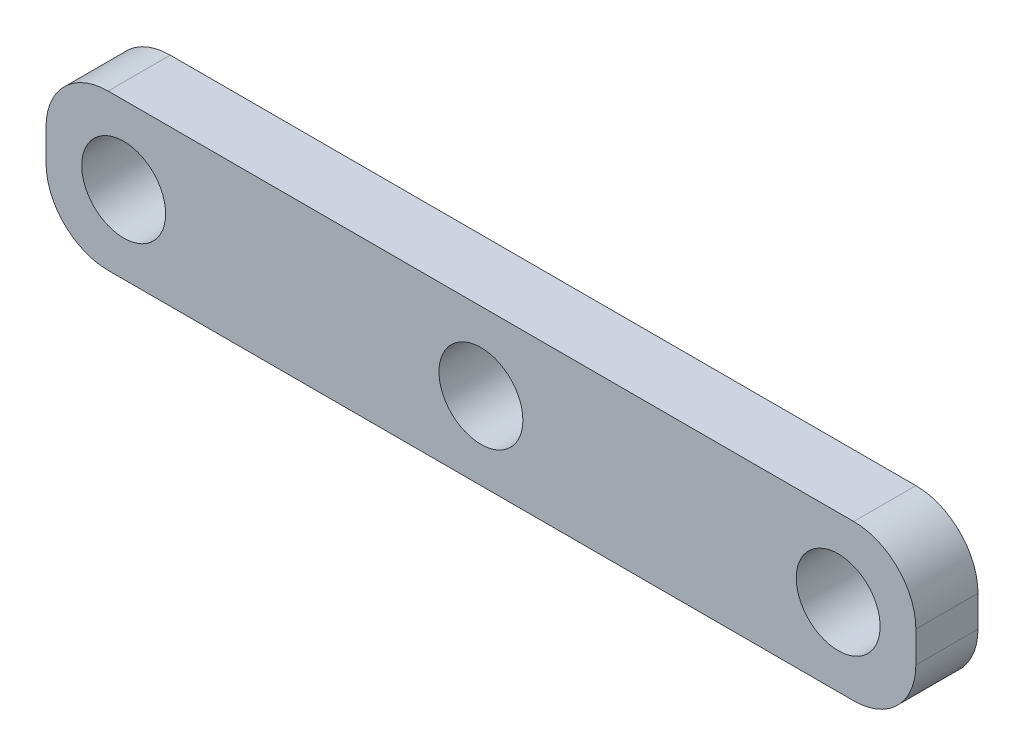
ISO-10303-21;
HEADER;
FILE_DESCRIPTION(('STEP AP214'),'2;1');
FILE_NAME('part.step','',(''),(''),'','','');
FILE_SCHEMA(('AUTOMOTIVE_DESIGN { 1 0 10303 214 1 1 1 1 }'));
ENDSEC;
DATA;
#1=APPLICATION_CONTEXT('core data for automotive mechanical design processes');
#2=APPLICATION_PROTOCOL_DEFINITION('international standard','automotive_design',2000,#1);
#3=PRODUCT_CONTEXT('',#1,'mechanical');
#4=PRODUCT('Part','Part','',(#3));
#5=PRODUCT_RELATED_PRODUCT_CATEGORY('part','',(#4));
#6=PRODUCT_DEFINITION_FORMATION('','',#4);
#7=PRODUCT_DEFINITION_CONTEXT('part definition',#1,'design');
#8=PRODUCT_DEFINITION('design','',#6,#7);
#9=PRODUCT_DEFINITION_SHAPE('','',#8);
#10=(LENGTH_UNIT() NAMED_UNIT(*) SI_UNIT(.MILLI.,.METRE.));
#11=(NAMED_UNIT(*) PLANE_ANGLE_UNIT() SI_UNIT($,.RADIAN.));
#12=(NAMED_UNIT(*) SI_UNIT($,.STERADIAN.) SOLID_ANGLE_UNIT());
#13=UNCERTAINTY_MEASURE_WITH_UNIT(LENGTH_MEASURE(1.E-05),#10,'distance_accuracy_value','');
#14=(GEOMETRIC_REPRESENTATION_CONTEXT(3) GLOBAL_UNCERTAINTY_ASSIGNED_CONTEXT((#13)) GLOBAL_UNIT_ASSIGNED_CONTEXT((#10,
#11,#12)) REPRESENTATION_CONTEXT('',''));
#15=CARTESIAN_POINT('',(0.,0.,0.));
#16=DIRECTION('',(0.,0.,1.));
#17=DIRECTION('',(1.,0.,0.));
#18=AXIS2_PLACEMENT_3D('',#15,#16,#17);
#19=CARTESIAN_POINT('',(0.,0.,2.));
#20=DIRECTION('',(0.,0.,-1.));
#21=DIRECTION('',(-1.,0.,0.));
#22=AXIS2_PLACEMENT_3D('',#19,#20,#21);
#23=PLANE('',#22);
#24=DIRECTION('',(1.,0.,0.));
#25=VECTOR('',#24,1.);
#26=CARTESIAN_POINT('',(-14.,-2.5,2.));
#27=LINE('',#26,#25);
#28=CARTESIAN_POINT('',(-12.,-2.5,2.));
#29=VERTEX_POINT('',#28);
#30=CARTESIAN_POINT('',(12.,-2.5,2.));
#31=VERTEX_POINT('',#30);
#32=EDGE_CURVE('E138',#29,#31,#27,.T.);
#33=ORIENTED_EDGE('',*,*,#32,.T.);
#34=CARTESIAN_POINT('',(12.,-0.500000000000002,2.));
#35=DIRECTION('',(0.,0.,-1.));
#36=DIRECTION('',(-1.,0.,0.));
#37=AXIS2_PLACEMENT_3D('',#34,#35,#36);
#38=CIRCLE('',#37,2.);
#39=CARTESIAN_POINT('',(14.,-0.500000000000003,2.));
#40=VERTEX_POINT('',#39);
#41=EDGE_CURVE('E157',#31,#40,#38,.F.);
#42=ORIENTED_EDGE('',*,*,#41,.T.);
#43=DIRECTION('',(0.,1.,0.));
#44=VECTOR('',#43,1.);
#45=CARTESIAN_POINT('',(14.,-2.5,2.));
#46=LINE('',#45,#44);
#47=CARTESIAN_POINT('',(14.,0.499999999999997,2.));
#48=VERTEX_POINT('',#47);
#49=EDGE_CURVE('E121',#40,#48,#46,.T.);
#50=ORIENTED_EDGE('',*,*,#49,.T.);
#51=CARTESIAN_POINT('',(12.,0.499999999999998,2.));
#52=DIRECTION('',(0.,0.,-1.));
#53=DIRECTION('',(-1.,0.,0.));
#54=AXIS2_PLACEMENT_3D('',#51,#52,#53);
#55=CIRCLE('',#54,2.);
#56=CARTESIAN_POINT('',(12.,2.5,2.));
#57=VERTEX_POINT('',#56);
#58=EDGE_CURVE('E152',#48,#57,#55,.F.);
#59=ORIENTED_EDGE('',*,*,#58,.T.);
#60=DIRECTION('',(-1.,0.,0.));
#61=VECTOR('',#60,1.);
#62=CARTESIAN_POINT('',(-14.,2.5,2.));
#63=LINE('',#62,#61);
#64=CARTESIAN_POINT('',(-12.,2.5,2.));
#65=VERTEX_POINT('',#64);
#66=EDGE_CURVE('E168',#57,#65,#63,.T.);
#67=ORIENTED_EDGE('',*,*,#66,.T.);
#68=CARTESIAN_POINT('',(-12.,0.500000000000001,2.));
#69=DIRECTION('',(0.,0.,-1.));
#70=DIRECTION('',(-1.,0.,0.));
#71=AXIS2_PLACEMENT_3D('',#68,#69,#70);
#72=CIRCLE('',#71,2.);
#73=CARTESIAN_POINT('',(-14.,0.500000000000001,2.));
#74=VERTEX_POINT('',#73);
#75=EDGE_CURVE('E57',#65,#74,#72,.F.);
#76=ORIENTED_EDGE('',*,*,#75,.T.);
#77=DIRECTION('',(0.,-1.,0.));
#78=VECTOR('',#77,1.);
#79=CARTESIAN_POINT('',(-14.,-2.5,2.));
#80=LINE('',#79,#78);
#81=CARTESIAN_POINT('',(-14.,-0.499999999999999,2.));
#82=VERTEX_POINT('',#81);
#83=EDGE_CURVE('E176',#74,#82,#80,.T.);
#84=ORIENTED_EDGE('',*,*,#83,.T.);
#85=CARTESIAN_POINT('',(-12.,-0.499999999999999,2.));
#86=DIRECTION('',(0.,0.,-1.));
#87=DIRECTION('',(-1.,0.,0.));
#88=AXIS2_PLACEMENT_3D('',#85,#86,#87);
#89=CIRCLE('',#88,2.);
#90=EDGE_CURVE('E155',#82,#29,#89,.F.);
#91=ORIENTED_EDGE('',*,*,#90,.T.);
#92=EDGE_LOOP('',(#33,#42,#50,#59,#67,#76,#84,#91));
#93=FACE_BOUND('',#92,.T.);
#94=CARTESIAN_POINT('',(-11.5,0.,2.));
#95=DIRECTION('',(0.,0.,1.));
#96=DIRECTION('',(1.,0.,0.));
#97=AXIS2_PLACEMENT_3D('',#94,#95,#96);
#98=CIRCLE('',#97,1.35);
#99=CARTESIAN_POINT('',(-10.15,0.,2.));
#100=VERTEX_POINT('',#99);
#101=EDGE_CURVE('E129',#100,#100,#98,.T.);
#102=ORIENTED_EDGE('',*,*,#101,.F.);
#103=EDGE_LOOP('',(#102));
#104=FACE_BOUND('',#103,.T.);
#105=CARTESIAN_POINT('',(11.5,0.,2.));
#106=DIRECTION('',(0.,0.,1.));
#107=DIRECTION('',(-1.,0.,0.));
#108=AXIS2_PLACEMENT_3D('',#105,#106,#107);
#109=CIRCLE('',#108,1.35);
#110=CARTESIAN_POINT('',(10.15,0.,2.));
#111=VERTEX_POINT('',#110);
#112=EDGE_CURVE('E183',#111,#111,#109,.T.);
#113=ORIENTED_EDGE('',*,*,#112,.F.);
#114=EDGE_LOOP('',(#113));
#115=FACE_BOUND('',#114,.T.);
#116=CARTESIAN_POINT('',(0.,0.,2.));
#117=DIRECTION('',(0.,0.,1.));
#118=DIRECTION('',(1.,0.,0.));
#119=AXIS2_PLACEMENT_3D('',#116,#117,#118);
#120=CIRCLE('',#119,1.35);
#121=CARTESIAN_POINT('',(1.35,0.,2.));
#122=VERTEX_POINT('',#121);
#123=EDGE_CURVE('E188',#122,#122,#120,.T.);
#124=ORIENTED_EDGE('',*,*,#123,.F.);
#125=EDGE_LOOP('',(#124));
#126=FACE_BOUND('',#125,.T.);
#127=ADVANCED_FACE('F35',(#93,#104,#115,#126),#23,.F.);
#128=CARTESIAN_POINT('',(0.,0.,0.));
#129=DIRECTION('',(0.,0.,-1.));
#130=DIRECTION('',(-1.,0.,0.));
#131=AXIS2_PLACEMENT_3D('',#128,#129,#130);
#132=PLANE('',#131);
#133=CARTESIAN_POINT('',(11.5,0.,0.));
#134=DIRECTION('',(0.,0.,1.));
#135=DIRECTION('',(-1.,0.,0.));
#136=AXIS2_PLACEMENT_3D('',#133,#134,#135);
#137=CIRCLE('',#136,1.35);
#138=CARTESIAN_POINT('',(10.15,0.,0.));
#139=VERTEX_POINT('',#138);
#140=EDGE_CURVE('E185',#139,#139,#137,.T.);
#141=ORIENTED_EDGE('',*,*,#140,.T.);
#142=EDGE_LOOP('',(#141));
#143=FACE_BOUND('',#142,.T.);
#144=DIRECTION('',(0.,1.,0.));
#145=VECTOR('',#144,1.);
#146=CARTESIAN_POINT('',(14.,-2.5,0.));
#147=LINE('',#146,#145);
#148=CARTESIAN_POINT('',(14.,-0.500000000000003,0.));
#149=VERTEX_POINT('',#148);
#150=CARTESIAN_POINT('',(14.,0.499999999999997,0.));
#151=VERTEX_POINT('',#150);
#152=EDGE_CURVE('E118',#149,#151,#147,.T.);
#153=ORIENTED_EDGE('',*,*,#152,.F.);
#154=CARTESIAN_POINT('',(12.,-0.500000000000002,0.));
#155=DIRECTION('',(0.,0.,-1.));
#156=DIRECTION('',(-1.,0.,0.));
#157=AXIS2_PLACEMENT_3D('',#154,#155,#156);
#158=CIRCLE('',#157,2.);
#159=CARTESIAN_POINT('',(12.,-2.5,0.));
#160=VERTEX_POINT('',#159);
#161=EDGE_CURVE('E101',#149,#160,#158,.T.);
#162=ORIENTED_EDGE('',*,*,#161,.T.);
#163=DIRECTION('',(1.,0.,0.));
#164=VECTOR('',#163,1.);
#165=CARTESIAN_POINT('',(-14.,-2.5,0.));
#166=LINE('',#165,#164);
#167=CARTESIAN_POINT('',(-12.,-2.5,0.));
#168=VERTEX_POINT('',#167);
#169=EDGE_CURVE('E142',#168,#160,#166,.T.);
#170=ORIENTED_EDGE('',*,*,#169,.F.);
#171=CARTESIAN_POINT('',(-12.,-0.499999999999999,0.));
#172=DIRECTION('',(0.,0.,-1.));
#173=DIRECTION('',(-1.,0.,0.));
#174=AXIS2_PLACEMENT_3D('',#171,#172,#173);
#175=CIRCLE('',#174,2.);
#176=CARTESIAN_POINT('',(-14.,-0.499999999999999,0.));
#177=VERTEX_POINT('',#176);
#178=EDGE_CURVE('E112',#168,#177,#175,.T.);
#179=ORIENTED_EDGE('',*,*,#178,.T.);
#180=DIRECTION('',(0.,-1.,0.));
#181=VECTOR('',#180,1.);
#182=CARTESIAN_POINT('',(-14.,-2.5,0.));
#183=LINE('',#182,#181);
#184=CARTESIAN_POINT('',(-14.,0.500000000000001,0.));
#185=VERTEX_POINT('',#184);
#186=EDGE_CURVE('E132',#185,#177,#183,.T.);
#187=ORIENTED_EDGE('',*,*,#186,.F.);
#188=CARTESIAN_POINT('',(-12.,0.500000000000001,0.));
#189=DIRECTION('',(0.,0.,-1.));
#190=DIRECTION('',(-1.,0.,0.));
#191=AXIS2_PLACEMENT_3D('',#188,#189,#190);
#192=CIRCLE('',#191,2.);
#193=CARTESIAN_POINT('',(-12.,2.5,0.));
#194=VERTEX_POINT('',#193);
#195=EDGE_CURVE('E146',#185,#194,#192,.T.);
#196=ORIENTED_EDGE('',*,*,#195,.T.);
#197=DIRECTION('',(-1.,0.,0.));
#198=VECTOR('',#197,1.);
#199=CARTESIAN_POINT('',(-14.,2.5,0.));
#200=LINE('',#199,#198);
#201=CARTESIAN_POINT('',(12.,2.5,0.));
#202=VERTEX_POINT('',#201);
#203=EDGE_CURVE('E128',#202,#194,#200,.T.);
#204=ORIENTED_EDGE('',*,*,#203,.F.);
#205=CARTESIAN_POINT('',(12.,0.499999999999998,0.));
#206=DIRECTION('',(0.,0.,-1.));
#207=DIRECTION('',(-1.,0.,0.));
#208=AXIS2_PLACEMENT_3D('',#205,#206,#207);
#209=CIRCLE('',#208,2.);
#210=EDGE_CURVE('E122',#202,#151,#209,.T.);
#211=ORIENTED_EDGE('',*,*,#210,.T.);
#212=EDGE_LOOP('',(#153,#162,#170,#179,#187,#196,#204,#211));
#213=FACE_BOUND('',#212,.T.);
#214=CARTESIAN_POINT('',(-11.5,0.,0.));
#215=DIRECTION('',(0.,0.,1.));
#216=DIRECTION('',(1.,0.,0.));
#217=AXIS2_PLACEMENT_3D('',#214,#215,#216);
#218=CIRCLE('',#217,1.35);
#219=CARTESIAN_POINT('',(-10.15,0.,0.));
#220=VERTEX_POINT('',#219);
#221=EDGE_CURVE('E135',#220,#220,#218,.T.);
#222=ORIENTED_EDGE('',*,*,#221,.T.);
#223=EDGE_LOOP('',(#222));
#224=FACE_BOUND('',#223,.T.);
#225=CARTESIAN_POINT('',(0.,0.,0.));
#226=DIRECTION('',(0.,0.,1.));
#227=DIRECTION('',(1.,0.,0.));
#228=AXIS2_PLACEMENT_3D('',#225,#226,#227);
#229=CIRCLE('',#228,1.35);
#230=CARTESIAN_POINT('',(1.35,0.,0.));
#231=VERTEX_POINT('',#230);
#232=EDGE_CURVE('E191',#231,#231,#229,.T.);
#233=ORIENTED_EDGE('',*,*,#232,.T.);
#234=EDGE_LOOP('',(#233));
#235=FACE_BOUND('',#234,.T.);
#236=ADVANCED_FACE('F125',(#143,#213,#224,#235),#132,.T.);
#237=CARTESIAN_POINT('',(14.,-2.5,2.));
#238=DIRECTION('',(-1.,0.,0.));
#239=DIRECTION('',(0.,-1.,0.));
#240=AXIS2_PLACEMENT_3D('',#237,#238,#239);
#241=PLANE('',#240);
#242=ORIENTED_EDGE('',*,*,#49,.F.);
#243=DIRECTION('',(0.,0.,-1.));
#244=VECTOR('',#243,1.);
#245=CARTESIAN_POINT('',(14.,-0.500000000000003,2.));
#246=LINE('',#245,#244);
#247=EDGE_CURVE('E105',#40,#149,#246,.T.);
#248=ORIENTED_EDGE('',*,*,#247,.T.);
#249=ORIENTED_EDGE('',*,*,#152,.T.);
#250=DIRECTION('',(0.,0.,-1.));
#251=VECTOR('',#250,1.);
#252=CARTESIAN_POINT('',(14.,0.499999999999997,2.));
#253=LINE('',#252,#251);
#254=EDGE_CURVE('E123',#151,#48,#253,.F.);
#255=ORIENTED_EDGE('',*,*,#254,.T.);
#256=EDGE_LOOP('',(#242,#248,#249,#255));
#257=FACE_BOUND('',#256,.T.);
#258=ADVANCED_FACE('F117',(#257),#241,.F.);
#259=CARTESIAN_POINT('',(-14.,2.5,2.));
#260=DIRECTION('',(0.,-1.,0.));
#261=DIRECTION('',(1.,0.,0.));
#262=AXIS2_PLACEMENT_3D('',#259,#260,#261);
#263=PLANE('',#262);
#264=ORIENTED_EDGE('',*,*,#203,.T.);
#265=DIRECTION('',(0.,0.,-1.));
#266=VECTOR('',#265,1.);
#267=CARTESIAN_POINT('',(-12.,2.5,2.));
#268=LINE('',#267,#266);
#269=EDGE_CURVE('E11',#194,#65,#268,.F.);
#270=ORIENTED_EDGE('',*,*,#269,.T.);
#271=ORIENTED_EDGE('',*,*,#66,.F.);
#272=DIRECTION('',(0.,0.,-1.));
#273=VECTOR('',#272,1.);
#274=CARTESIAN_POINT('',(12.,2.5,2.));
#275=LINE('',#274,#273);
#276=EDGE_CURVE('E43',#57,#202,#275,.T.);
#277=ORIENTED_EDGE('',*,*,#276,.T.);
#278=EDGE_LOOP('',(#264,#270,#271,#277));
#279=FACE_BOUND('',#278,.T.);
#280=ADVANCED_FACE('F166',(#279),#263,.F.);
#281=CARTESIAN_POINT('',(-14.,-2.5,2.));
#282=DIRECTION('',(1.,0.,0.));
#283=DIRECTION('',(0.,0.,-1.));
#284=AXIS2_PLACEMENT_3D('',#281,#282,#283);
#285=PLANE('',#284);
#286=ORIENTED_EDGE('',*,*,#186,.T.);
#287=DIRECTION('',(0.,0.,-1.));
#288=VECTOR('',#287,1.);
#289=CARTESIAN_POINT('',(-14.,-0.499999999999999,2.));
#290=LINE('',#289,#288);
#291=EDGE_CURVE('E50',#177,#82,#290,.F.);
#292=ORIENTED_EDGE('',*,*,#291,.T.);
#293=ORIENTED_EDGE('',*,*,#83,.F.);
#294=DIRECTION('',(0.,0.,-1.));
#295=VECTOR('',#294,1.);
#296=CARTESIAN_POINT('',(-14.,0.500000000000001,2.));
#297=LINE('',#296,#295);
#298=EDGE_CURVE('E159',#74,#185,#297,.T.);
#299=ORIENTED_EDGE('',*,*,#298,.T.);
#300=EDGE_LOOP('',(#286,#292,#293,#299));
#301=FACE_BOUND('',#300,.T.);
#302=ADVANCED_FACE('F175',(#301),#285,.F.);
#303=CARTESIAN_POINT('',(-14.,-2.5,2.));
#304=DIRECTION('',(0.,1.,0.));
#305=DIRECTION('',(-1.,0.,0.));
#306=AXIS2_PLACEMENT_3D('',#303,#304,#305);
#307=PLANE('',#306);
#308=ORIENTED_EDGE('',*,*,#169,.T.);
#309=DIRECTION('',(0.,0.,-1.));
#310=VECTOR('',#309,1.);
#311=CARTESIAN_POINT('',(12.,-2.5,2.));
#312=LINE('',#311,#310);
#313=EDGE_CURVE('E106',#160,#31,#312,.F.);
#314=ORIENTED_EDGE('',*,*,#313,.T.);
#315=ORIENTED_EDGE('',*,*,#32,.F.);
#316=DIRECTION('',(0.,0.,-1.));
#317=VECTOR('',#316,1.);
#318=CARTESIAN_POINT('',(-12.,-2.5,2.));
#319=LINE('',#318,#317);
#320=EDGE_CURVE('E111',#29,#168,#319,.T.);
#321=ORIENTED_EDGE('',*,*,#320,.T.);
#322=EDGE_LOOP('',(#308,#314,#315,#321));
#323=FACE_BOUND('',#322,.T.);
#324=ADVANCED_FACE('F212',(#323),#307,.F.);
#325=CARTESIAN_POINT('',(-11.5,0.,2.));
#326=DIRECTION('',(0.,0.,-1.));
#327=DIRECTION('',(-1.,0.,0.));
#328=AXIS2_PLACEMENT_3D('',#325,#326,#327);
#329=CYLINDRICAL_SURFACE('',#328,1.35);
#330=ORIENTED_EDGE('',*,*,#101,.T.);
#331=EDGE_LOOP('',(#330));
#332=FACE_BOUND('',#331,.T.);
#333=ORIENTED_EDGE('',*,*,#221,.F.);
#334=EDGE_LOOP('',(#333));
#335=FACE_BOUND('',#334,.T.);
#336=ADVANCED_FACE('F209',(#332,#335),#329,.F.);
#337=CARTESIAN_POINT('',(11.5,0.,2.));
#338=DIRECTION('',(0.,0.,-1.));
#339=DIRECTION('',(-1.,0.,0.));
#340=AXIS2_PLACEMENT_3D('',#337,#338,#339);
#341=CYLINDRICAL_SURFACE('',#340,1.35);
#342=ORIENTED_EDGE('',*,*,#112,.T.);
#343=EDGE_LOOP('',(#342));
#344=FACE_BOUND('',#343,.T.);
#345=ORIENTED_EDGE('',*,*,#140,.F.);
#346=EDGE_LOOP('',(#345));
#347=FACE_BOUND('',#346,.T.);
#348=ADVANCED_FACE('F296',(#344,#347),#341,.F.);
#349=CARTESIAN_POINT('',(0.,0.,2.));
#350=DIRECTION('',(0.,0.,-1.));
#351=DIRECTION('',(-1.,0.,0.));
#352=AXIS2_PLACEMENT_3D('',#349,#350,#351);
#353=CYLINDRICAL_SURFACE('',#352,1.35);
#354=ORIENTED_EDGE('',*,*,#123,.T.);
#355=EDGE_LOOP('',(#354));
#356=FACE_BOUND('',#355,.T.);
#357=ORIENTED_EDGE('',*,*,#232,.F.);
#358=EDGE_LOOP('',(#357));
#359=FACE_BOUND('',#358,.T.);
#360=ADVANCED_FACE('F197',(#356,#359),#353,.F.);
#361=CARTESIAN_POINT('',(12.,-0.500000000000002,2.));
#362=DIRECTION('',(0.,0.,-1.));
#363=DIRECTION('',(-1.,0.,0.));
#364=AXIS2_PLACEMENT_3D('',#361,#362,#363);
#365=CYLINDRICAL_SURFACE('',#364,2.);
#366=ORIENTED_EDGE('',*,*,#41,.F.);
#367=ORIENTED_EDGE('',*,*,#313,.F.);
#368=ORIENTED_EDGE('',*,*,#161,.F.);
#369=ORIENTED_EDGE('',*,*,#247,.F.);
#370=EDGE_LOOP('',(#366,#367,#368,#369));
#371=FACE_BOUND('',#370,.T.);
#372=ADVANCED_FACE('F104',(#371),#365,.T.);
#373=CARTESIAN_POINT('',(-12.,-0.499999999999999,2.));
#374=DIRECTION('',(0.,0.,-1.));
#375=DIRECTION('',(-1.,0.,0.));
#376=AXIS2_PLACEMENT_3D('',#373,#374,#375);
#377=CYLINDRICAL_SURFACE('',#376,2.);
#378=ORIENTED_EDGE('',*,*,#90,.F.);
#379=ORIENTED_EDGE('',*,*,#291,.F.);
#380=ORIENTED_EDGE('',*,*,#178,.F.);
#381=ORIENTED_EDGE('',*,*,#320,.F.);
#382=EDGE_LOOP('',(#378,#379,#380,#381));
#383=FACE_BOUND('',#382,.T.);
#384=ADVANCED_FACE('F224',(#383),#377,.T.);
#385=CARTESIAN_POINT('',(-12.,0.500000000000001,2.));
#386=DIRECTION('',(0.,0.,-1.));
#387=DIRECTION('',(-1.,0.,0.));
#388=AXIS2_PLACEMENT_3D('',#385,#386,#387);
#389=CYLINDRICAL_SURFACE('',#388,2.);
#390=ORIENTED_EDGE('',*,*,#75,.F.);
#391=ORIENTED_EDGE('',*,*,#269,.F.);
#392=ORIENTED_EDGE('',*,*,#195,.F.);
#393=ORIENTED_EDGE('',*,*,#298,.F.);
#394=EDGE_LOOP('',(#390,#391,#392,#393));
#395=FACE_BOUND('',#394,.T.);
#396=ADVANCED_FACE('F174',(#395),#389,.T.);
#397=CARTESIAN_POINT('',(12.,0.499999999999998,2.));
#398=DIRECTION('',(0.,0.,-1.));
#399=DIRECTION('',(-1.,0.,0.));
#400=AXIS2_PLACEMENT_3D('',#397,#398,#399);
#401=CYLINDRICAL_SURFACE('',#400,2.);
#402=ORIENTED_EDGE('',*,*,#58,.F.);
#403=ORIENTED_EDGE('',*,*,#254,.F.);
#404=ORIENTED_EDGE('',*,*,#210,.F.);
#405=ORIENTED_EDGE('',*,*,#276,.F.);
#406=EDGE_LOOP('',(#402,#403,#404,#405));
#407=FACE_BOUND('',#406,.T.);
#408=ADVANCED_FACE('F37',(#407),#401,.T.);
#409=CLOSED_SHELL('',(#127,#236,#258,#280,#302,#324,#336,#348,#360,#372,#384,#396,#408));
#410=MANIFOLD_SOLID_BREP('B2',#409);
#411=ADVANCED_BREP_SHAPE_REPRESENTATION('',(#18,#410),#14);
#412=SHAPE_DEFINITION_REPRESENTATION(#9,#411);
ENDSEC;
END-ISO-10303-21;
